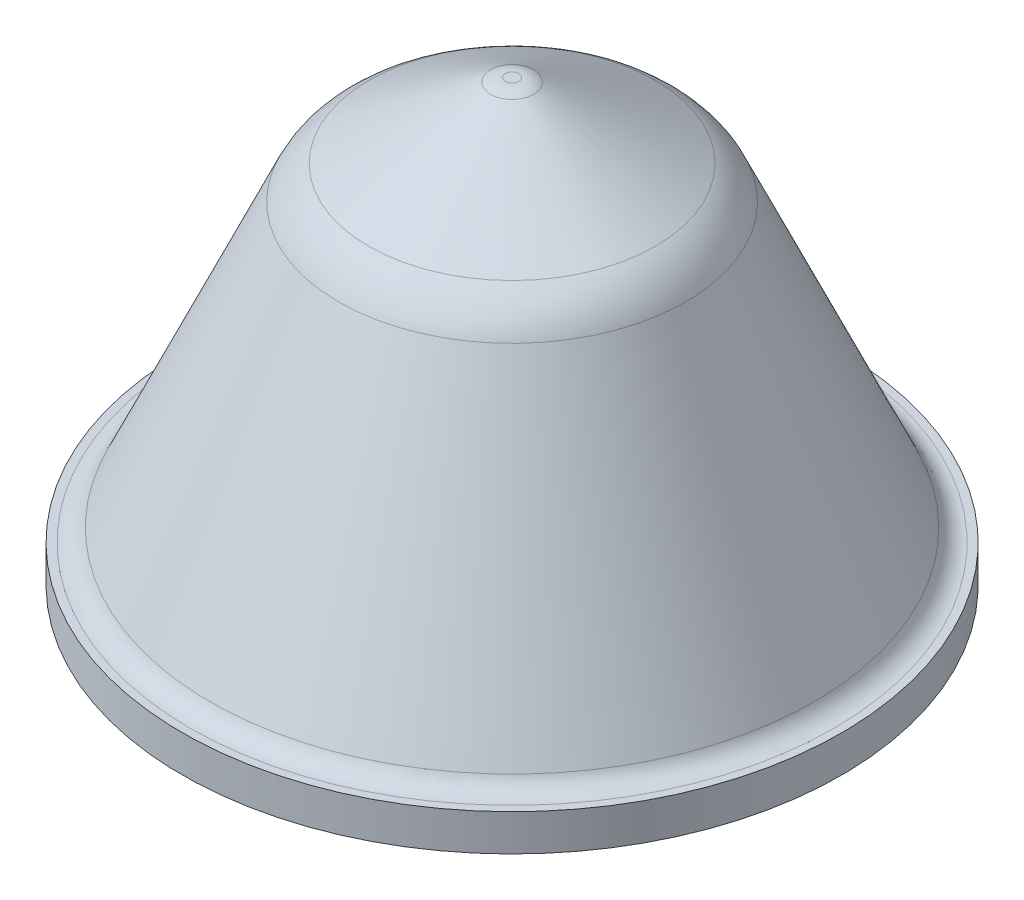
ISO-10303-21;
HEADER;
FILE_DESCRIPTION(('STEP AP214'),'2;1');
FILE_NAME('part.step','',(''),(''),'','','');
FILE_SCHEMA(('AUTOMOTIVE_DESIGN { 1 0 10303 214 1 1 1 1 }'));
ENDSEC;
DATA;
#1=APPLICATION_CONTEXT('core data for automotive mechanical design processes');
#2=APPLICATION_PROTOCOL_DEFINITION('international standard','automotive_design',2000,#1);
#3=PRODUCT_CONTEXT('',#1,'mechanical');
#4=PRODUCT('Part','Part','',(#3));
#5=PRODUCT_RELATED_PRODUCT_CATEGORY('part','',(#4));
#6=PRODUCT_DEFINITION_FORMATION('','',#4);
#7=PRODUCT_DEFINITION_CONTEXT('part definition',#1,'design');
#8=PRODUCT_DEFINITION('design','',#6,#7);
#9=PRODUCT_DEFINITION_SHAPE('','',#8);
#10=(LENGTH_UNIT() NAMED_UNIT(*) SI_UNIT(.MILLI.,.METRE.));
#11=(NAMED_UNIT(*) PLANE_ANGLE_UNIT() SI_UNIT($,.RADIAN.));
#12=(NAMED_UNIT(*) SI_UNIT($,.STERADIAN.) SOLID_ANGLE_UNIT());
#13=UNCERTAINTY_MEASURE_WITH_UNIT(LENGTH_MEASURE(1.E-05),#10,'distance_accuracy_value','');
#14=(GEOMETRIC_REPRESENTATION_CONTEXT(3) GLOBAL_UNCERTAINTY_ASSIGNED_CONTEXT((#13)) GLOBAL_UNIT_ASSIGNED_CONTEXT((#10,
#11,#12)) REPRESENTATION_CONTEXT('',''));
#15=CARTESIAN_POINT('',(0.,0.,0.));
#16=DIRECTION('',(0.,0.,1.));
#17=DIRECTION('',(1.,0.,0.));
#18=AXIS2_PLACEMENT_3D('',#15,#16,#17);
#19=CARTESIAN_POINT('',(0.,0.,0.));
#20=DIRECTION('',(0.,1.,0.));
#21=DIRECTION('',(0.,0.,1.));
#22=AXIS2_PLACEMENT_3D('',#19,#20,#21);
#23=PLANE('',#22);
#24=CARTESIAN_POINT('',(0.,1.51605840653759E-13,0.));
#25=DIRECTION('',(0.,-1.,0.));
#26=DIRECTION('',(0.,0.,-1.));
#27=AXIS2_PLACEMENT_3D('',#24,#25,#26);
#28=CIRCLE('',#27,45.);
#29=CARTESIAN_POINT('',(0.,3.08722591903681E-13,-45.));
#30=VERTEX_POINT('',#29);
#31=EDGE_CURVE('E73',#30,#30,#28,.T.);
#32=ORIENTED_EDGE('',*,*,#31,.T.);
#33=EDGE_LOOP('',(#32));
#34=FACE_BOUND('',#33,.T.);
#35=CARTESIAN_POINT('',(0.,0.,0.));
#36=DIRECTION('',(0.,-1.,0.));
#37=DIRECTION('',(0.,0.,-1.));
#38=AXIS2_PLACEMENT_3D('',#35,#36,#37);
#39=CIRCLE('',#38,4.24999999999999);
#40=CARTESIAN_POINT('',(0.,0.,-4.24999999999999));
#41=VERTEX_POINT('',#40);
#42=EDGE_CURVE('E74',#41,#41,#39,.T.);
#43=ORIENTED_EDGE('',*,*,#42,.F.);
#44=EDGE_LOOP('',(#43));
#45=FACE_BOUND('',#44,.T.);
#46=ADVANCED_FACE('F51',(#34,#45),#23,.F.);
#47=CARTESIAN_POINT('',(0.,60.,0.));
#48=DIRECTION('',(0.,-1.,0.));
#49=DIRECTION('',(0.,0.,-1.));
#50=AXIS2_PLACEMENT_3D('',#47,#48,#49);
#51=PLANE('',#50);
#52=CARTESIAN_POINT('',(0.,60.,2.09489001666563E-13));
#53=DIRECTION('',(0.,-1.,0.));
#54=DIRECTION('',(0.,0.,-1.));
#55=AXIS2_PLACEMENT_3D('',#52,#53,#54);
#56=CIRCLE('',#55,0.928203230275291);
#57=CARTESIAN_POINT('',(0.,60.,-0.928203230275081));
#58=VERTEX_POINT('',#57);
#59=EDGE_CURVE('E11',#58,#58,#56,.F.);
#60=ORIENTED_EDGE('',*,*,#59,.T.);
#61=EDGE_LOOP('',(#60));
#62=FACE_BOUND('',#61,.T.);
#63=ADVANCED_FACE('F121',(#62),#51,.F.);
#64=CARTESIAN_POINT('',(0.,60.,2.09489001666563E-13));
#65=DIRECTION('',(0.,-1.,0.));
#66=DIRECTION('',(0.,0.,-1.));
#67=AXIS2_PLACEMENT_3D('',#64,#65,#66);
#68=CONICAL_SURFACE('',#67,1.99999999999979,1.0471975511966);
#69=CARTESIAN_POINT('',(0.,59.4641016151378,2.07617921372571E-13));
#70=DIRECTION('',(0.,1.,0.));
#71=DIRECTION('',(0.,0.,1.));
#72=AXIS2_PLACEMENT_3D('',#69,#70,#71);
#73=CIRCLE('',#72,2.92820323027529);
#74=CARTESIAN_POINT('',(0.,59.4641016151378,-2.92820323027508));
#75=VERTEX_POINT('',#74);
#76=EDGE_CURVE('E59',#75,#75,#73,.F.);
#77=CARTESIAN_POINT('',(0.,49.8414809692326,1.74020701497125E-13));
#78=DIRECTION('',(0.,1.,0.));
#79=DIRECTION('',(0.,0.,1.));
#80=AXIS2_PLACEMENT_3D('',#77,#78,#79);
#81=CIRCLE('',#80,19.5950710909443);
#82=CARTESIAN_POINT('',(0.,49.8414809692326,-19.5950710909441));
#83=VERTEX_POINT('',#82);
#84=EDGE_CURVE('E100',#83,#83,#81,.T.);
#85=CARTESIAN_POINT('',(0.,59.4641016151378,-2.92820323027508));
#86=CARTESIAN_POINT('',(0.,59.3638659834096,-3.10181643715705));
#87=CARTESIAN_POINT('',(0.,59.2636303516814,-3.27542964403902));
#88=CARTESIAN_POINT('',(0.,59.0631590882251,-3.62265605780296));
#89=CARTESIAN_POINT('',(0.,58.9629234564969,-3.79626926468493));
#90=CARTESIAN_POINT('',(0.,58.7624521930405,-4.14349567844887));
#91=CARTESIAN_POINT('',(0.,58.6622165613123,-4.31710888533084));
#92=CARTESIAN_POINT('',(0.,58.461745297856,-4.66433529909477));
#93=CARTESIAN_POINT('',(0.,58.3615096661278,-4.83794850597674));
#94=CARTESIAN_POINT('',(0.,58.1610384026715,-5.18517491974068));
#95=CARTESIAN_POINT('',(0.,58.0608027709433,-5.35878812662265));
#96=CARTESIAN_POINT('',(0.,57.8603315074869,-5.70601454038659));
#97=CARTESIAN_POINT('',(0.,57.7600958757587,-5.87962774726856));
#98=CARTESIAN_POINT('',(0.,57.5596246123024,-6.2268541610325));
#99=CARTESIAN_POINT('',(0.,57.4593889805742,-6.40046736791446));
#100=CARTESIAN_POINT('',(0.,57.2589177171178,-6.7476937816784));
#101=CARTESIAN_POINT('',(0.,57.1586820853897,-6.92130698856037));
#102=CARTESIAN_POINT('',(0.,56.9582108219333,-7.26853340232431));
#103=CARTESIAN_POINT('',(0.,56.8579751902051,-7.44214660920628));
#104=CARTESIAN_POINT('',(0.,56.6575039267488,-7.78937302297022));
#105=CARTESIAN_POINT('',(0.,56.5572682950206,-7.96298622985219));
#106=CARTESIAN_POINT('',(0.,56.3567970315642,-8.31021264361612));
#107=CARTESIAN_POINT('',(0.,56.2565613998361,-8.48382585049809));
#108=CARTESIAN_POINT('',(0.,56.0560901363797,-8.83105226426203));
#109=CARTESIAN_POINT('',(0.,55.9558545046515,-9.004665471144));
#110=CARTESIAN_POINT('',(0.,55.7553832411952,-9.35189188490794));
#111=CARTESIAN_POINT('',(0.,55.655147609467,-9.52550509178991));
#112=CARTESIAN_POINT('',(0.,55.4546763460106,-9.87273150555384));
#113=CARTESIAN_POINT('',(0.,55.3544407142825,-10.0463447124358));
#114=CARTESIAN_POINT('',(0.,55.1539694508261,-10.3935711261998));
#115=CARTESIAN_POINT('',(0.,55.0537338190979,-10.5671843330817));
#116=CARTESIAN_POINT('',(0.,54.8532625556416,-10.9144107468457));
#117=CARTESIAN_POINT('',(0.,54.7530269239134,-11.0880239537276));
#118=CARTESIAN_POINT('',(0.,54.552555660457,-11.4352503674916));
#119=CARTESIAN_POINT('',(0.,54.4523200287288,-11.6088635743735));
#120=CARTESIAN_POINT('',(0.,54.2518487652725,-11.9560899881375));
#121=CARTESIAN_POINT('',(0.,54.1516131335443,-12.1297031950194));
#122=CARTESIAN_POINT('',(0.,53.9511418700879,-12.4769296087834));
#123=CARTESIAN_POINT('',(0.,53.8509062383598,-12.6505428156653));
#124=CARTESIAN_POINT('',(0.,53.6504349749034,-12.9977692294293));
#125=CARTESIAN_POINT('',(0.,53.5501993431752,-13.1713824363113));
#126=CARTESIAN_POINT('',(0.,53.3497280797189,-13.5186088500752));
#127=CARTESIAN_POINT('',(0.,53.2494924479907,-13.6922220569572));
#128=CARTESIAN_POINT('',(0.,53.0490211845343,-14.0394484707211));
#129=CARTESIAN_POINT('',(0.,52.9487855528062,-14.2130616776031));
#130=CARTESIAN_POINT('',(0.,52.7483142893498,-14.560288091367));
#131=CARTESIAN_POINT('',(0.,52.6480786576216,-14.733901298249));
#132=CARTESIAN_POINT('',(0.,52.4476073941653,-15.0811277120129));
#133=CARTESIAN_POINT('',(0.,52.3473717624371,-15.2547409188949));
#134=CARTESIAN_POINT('',(0.,52.1469004989807,-15.6019673326588));
#135=CARTESIAN_POINT('',(0.,52.0466648672526,-15.7755805395408));
#136=CARTESIAN_POINT('',(0.,51.8461936037962,-16.1228069533047));
#137=CARTESIAN_POINT('',(0.,51.745957972068,-16.2964201601867));
#138=CARTESIAN_POINT('',(0.,51.5454867086117,-16.6436465739506));
#139=CARTESIAN_POINT('',(0.,51.4452510768835,-16.8172597808326));
#140=CARTESIAN_POINT('',(0.,51.2447798134271,-17.1644861945965));
#141=CARTESIAN_POINT('',(0.,51.144544181699,-17.3380994014785));
#142=CARTESIAN_POINT('',(0.,50.9440729182426,-17.6853258152425));
#143=CARTESIAN_POINT('',(0.,50.8438372865144,-17.8589390221244));
#144=CARTESIAN_POINT('',(0.,50.6433660230581,-18.2061654358884));
#145=CARTESIAN_POINT('',(0.,50.5431303913299,-18.3797786427703));
#146=CARTESIAN_POINT('',(0.,50.3426591278735,-18.7270050565343));
#147=CARTESIAN_POINT('',(0.,50.2424234961453,-18.9006182634162));
#148=CARTESIAN_POINT('',(0.,50.041952232689,-19.2478446771802));
#149=CARTESIAN_POINT('',(0.,49.9417166009608,-19.4214578840621));
#150=CARTESIAN_POINT('',(0.,49.8414809692326,-19.5950710909441));
#151=B_SPLINE_CURVE_WITH_KNOTS('',3,(#85,#86,#87,#88,#89,#90,#91,#92,#93,#94,#95,#96,#97,#98,
#99,#100,#101,#102,#103,#104,#105,#106,#107,#108,#109,#110,#111,#112,#113,#114,#115,#116,#117,
#118,#119,#120,#121,#122,#123,#124,#125,#126,#127,#128,#129,#130,#131,#132,#133,#134,#135,#136,
#137,#138,#139,#140,#141,#142,#143,#144,#145,#146,#147,#148,#149,#150),.UNSPECIFIED.,.F.,.F.,(4,
2,2,2,2,2,2,2,2,2,2,2,2,2,2,2,2,2,2,2,2,2,2,2,2,2,2,2,2,2,2,2,4),(0.,0.60141379036907,
1.20282758073814,1.80424137110722,2.40565516147629,3.00706895184536,3.60848274221444,
4.20989653258351,4.81131032295258,5.41272411332165,6.01413790369073,6.6155516940598,
7.21696548442887,7.81837927479795,8.41979306516702,9.0212068555361,9.62262064590517,
10.2240344362742,10.8254482266433,11.4268620170124,12.0282758073815,12.6296895977505,
13.2311033881196,13.8325171784887,14.4339309688577,15.0353447592268,15.6367585495959,
16.238172339965,16.8395861303341,17.4409999207031,18.0424137110722,18.6438275014413,
19.2452412918103),.UNSPECIFIED.);
#152=EDGE_CURVE('BSEAM108',#75,#83,#151,.T.);
#153=ORIENTED_EDGE('',*,*,#76,.T.);
#154=ORIENTED_EDGE('',*,*,#84,.T.);
#155=ORIENTED_EDGE('',*,*,#152,.T.);
#156=ORIENTED_EDGE('',*,*,#152,.F.);
#157=EDGE_LOOP('',(#153,#155,#154,#156));
#158=FACE_BOUND('',#157,.T.);
#159=ADVANCED_FACE('F108',(#158),#68,.T.);
#160=CARTESIAN_POINT('',(0.,48.2368165841388,1.68418042496406E-13));
#161=DIRECTION('',(0.,-1.,0.));
#162=DIRECTION('',(0.,0.,-1.));
#163=AXIS2_PLACEMENT_3D('',#160,#161,#162);
#164=CONICAL_SURFACE('',#163,22.3744313350229,0.42609967327026);
#165=CARTESIAN_POINT('',(0.,45.3144507031724,1.58214650647938E-13));
#166=DIRECTION('',(0.,1.,0.));
#167=DIRECTION('',(0.,0.,1.));
#168=AXIS2_PLACEMENT_3D('',#165,#166,#167);
#169=CIRCLE('',#168,23.7009187314639);
#170=CARTESIAN_POINT('',(0.,45.3144507031724,23.7009187314641));
#171=VERTEX_POINT('',#170);
#172=EDGE_CURVE('E96',#171,#171,#169,.F.);
#173=ORIENTED_EDGE('',*,*,#172,.T.);
#174=EDGE_LOOP('',(#173));
#175=FACE_BOUND('',#174,.T.);
#176=CARTESIAN_POINT('',(0.,6.76003286846487,0.));
#177=DIRECTION('',(0.,-1.,0.));
#178=DIRECTION('',(0.,0.,-1.));
#179=AXIS2_PLACEMENT_3D('',#176,#177,#178);
#180=CIRCLE('',#179,41.2011057094027);
#181=CARTESIAN_POINT('',(0.,6.76003286846501,-41.2011057094027));
#182=VERTEX_POINT('',#181);
#183=EDGE_CURVE('E92',#182,#182,#180,.F.);
#184=ORIENTED_EDGE('',*,*,#183,.T.);
#185=EDGE_LOOP('',(#184));
#186=FACE_BOUND('',#185,.T.);
#187=ADVANCED_FACE('F140',(#175,#186),#164,.T.);
#188=CARTESIAN_POINT('',(0.,4.99999999999999,45.));
#189=DIRECTION('',(0.,-1.,0.));
#190=DIRECTION('',(0.,0.,-1.));
#191=AXIS2_PLACEMENT_3D('',#188,#189,#190);
#192=PLANE('',#191);
#193=CARTESIAN_POINT('',(0.,5.00000000000015,0.));
#194=DIRECTION('',(0.,-1.,0.));
#195=DIRECTION('',(0.,0.,-1.));
#196=AXIS2_PLACEMENT_3D('',#193,#194,#195);
#197=CIRCLE('',#196,43.9328600015586);
#198=CARTESIAN_POINT('',(0.,5.0000000000003,-43.9328600015586));
#199=VERTEX_POINT('',#198);
#200=EDGE_CURVE('E88',#199,#199,#197,.T.);
#201=ORIENTED_EDGE('',*,*,#200,.T.);
#202=EDGE_LOOP('',(#201));
#203=FACE_BOUND('',#202,.T.);
#204=CARTESIAN_POINT('',(0.,5.00000000000015,0.));
#205=DIRECTION('',(0.,-1.,0.));
#206=DIRECTION('',(0.,0.,-1.));
#207=AXIS2_PLACEMENT_3D('',#204,#205,#206);
#208=CIRCLE('',#207,45.);
#209=CARTESIAN_POINT('',(0.,5.00000000000031,-45.));
#210=VERTEX_POINT('',#209);
#211=EDGE_CURVE('E80',#210,#210,#208,.T.);
#212=ORIENTED_EDGE('',*,*,#211,.F.);
#213=EDGE_LOOP('',(#212));
#214=FACE_BOUND('',#213,.T.);
#215=ADVANCED_FACE('F136',(#203,#214),#192,.F.);
#216=CARTESIAN_POINT('',(0.,0.,0.));
#217=DIRECTION('',(0.,-1.,0.));
#218=DIRECTION('',(0.,0.,-1.));
#219=AXIS2_PLACEMENT_3D('',#216,#217,#218);
#220=CYLINDRICAL_SURFACE('',#219,45.);
#221=ORIENTED_EDGE('',*,*,#31,.F.);
#222=EDGE_LOOP('',(#221));
#223=FACE_BOUND('',#222,.T.);
#224=ORIENTED_EDGE('',*,*,#211,.T.);
#225=EDGE_LOOP('',(#224));
#226=FACE_BOUND('',#225,.T.);
#227=ADVANCED_FACE('F133',(#223,#226),#220,.T.);
#228=CARTESIAN_POINT('',(0.,8.00000000000015,0.));
#229=DIRECTION('',(0.,-1.,0.));
#230=DIRECTION('',(0.,0.,-1.));
#231=AXIS2_PLACEMENT_3D('',#228,#229,#230);
#232=TOROIDAL_SURFACE('',#231,43.9328600015586,3.);
#233=ORIENTED_EDGE('',*,*,#183,.F.);
#234=EDGE_LOOP('',(#233));
#235=FACE_BOUND('',#234,.T.);
#236=ORIENTED_EDGE('',*,*,#200,.F.);
#237=EDGE_LOOP('',(#236));
#238=FACE_BOUND('',#237,.T.);
#239=ADVANCED_FACE('F66',(#235,#238),#232,.F.);
#240=CARTESIAN_POINT('',(0.,27.5,0.));
#241=DIRECTION('',(0.,-1.,0.));
#242=DIRECTION('',(0.,0.,-1.));
#243=AXIS2_PLACEMENT_3D('',#240,#241,#242);
#244=CONICAL_SURFACE('',#243,4.24999999999999,1.02974425867665);
#245=CARTESIAN_POINT('',(0.,30.0536576308671,0.));
#246=VERTEX_POINT('',#245);
#247=VERTEX_LOOP('',#246);
#248=FACE_BOUND('',#247,.T.);
#249=CARTESIAN_POINT('',(0.,27.5,0.));
#250=DIRECTION('',(0.,-1.,0.));
#251=DIRECTION('',(0.,0.,-1.));
#252=AXIS2_PLACEMENT_3D('',#249,#250,#251);
#253=CIRCLE('',#252,4.24999999999999);
#254=CARTESIAN_POINT('',(0.,27.5,-4.24999999999999));
#255=VERTEX_POINT('',#254);
#256=EDGE_CURVE('E70',#255,#255,#253,.T.);
#257=ORIENTED_EDGE('',*,*,#256,.T.);
#258=EDGE_LOOP('',(#257));
#259=FACE_BOUND('',#258,.T.);
#260=ADVANCED_FACE('F62',(#248,#259),#244,.F.);
#261=CARTESIAN_POINT('',(0.,0.,0.));
#262=DIRECTION('',(0.,-1.,0.));
#263=DIRECTION('',(0.,0.,-1.));
#264=AXIS2_PLACEMENT_3D('',#261,#262,#263);
#265=CYLINDRICAL_SURFACE('',#264,4.24999999999999);
#266=ORIENTED_EDGE('',*,*,#256,.F.);
#267=EDGE_LOOP('',(#266));
#268=FACE_BOUND('',#267,.T.);
#269=ORIENTED_EDGE('',*,*,#42,.T.);
#270=EDGE_LOOP('',(#269));
#271=FACE_BOUND('',#270,.T.);
#272=ADVANCED_FACE('F65',(#268,#271),#265,.F.);
#273=CARTESIAN_POINT('',(0.,41.1812269313882,1.43783568621011E-13));
#274=DIRECTION('',(0.,1.,0.));
#275=DIRECTION('',(0.,0.,1.));
#276=AXIS2_PLACEMENT_3D('',#273,#274,#275);
#277=TOROIDAL_SURFACE('',#276,14.5950710909443,10.);
#278=ORIENTED_EDGE('',*,*,#84,.F.);
#279=EDGE_LOOP('',(#278));
#280=FACE_BOUND('',#279,.T.);
#281=ORIENTED_EDGE('',*,*,#172,.F.);
#282=EDGE_LOOP('',(#281));
#283=FACE_BOUND('',#282,.T.);
#284=ADVANCED_FACE('F112',(#280,#283),#277,.T.);
#285=CARTESIAN_POINT('',(0.,56.,1.95523068222125E-13));
#286=DIRECTION('',(0.,-1.,0.));
#287=DIRECTION('',(0.,0.,-1.));
#288=AXIS2_PLACEMENT_3D('',#285,#286,#287);
#289=DEGENERATE_TOROIDAL_SURFACE('',#288,0.928203230275291,4.,.T.);
#290=ORIENTED_EDGE('',*,*,#59,.F.);
#291=EDGE_LOOP('',(#290));
#292=FACE_BOUND('',#291,.T.);
#293=ORIENTED_EDGE('',*,*,#76,.F.);
#294=EDGE_LOOP('',(#293));
#295=FACE_BOUND('',#294,.T.);
#296=ADVANCED_FACE('F53',(#292,#295),#289,.T.);
#297=CLOSED_SHELL('',(#46,#63,#159,#187,#215,#227,#239,#260,#272,#284,#296));
#298=MANIFOLD_SOLID_BREP('B2',#297);
#299=ADVANCED_BREP_SHAPE_REPRESENTATION('',(#18,#298),#14);
#300=SHAPE_DEFINITION_REPRESENTATION(#9,#299);
ENDSEC;
END-ISO-10303-21;
